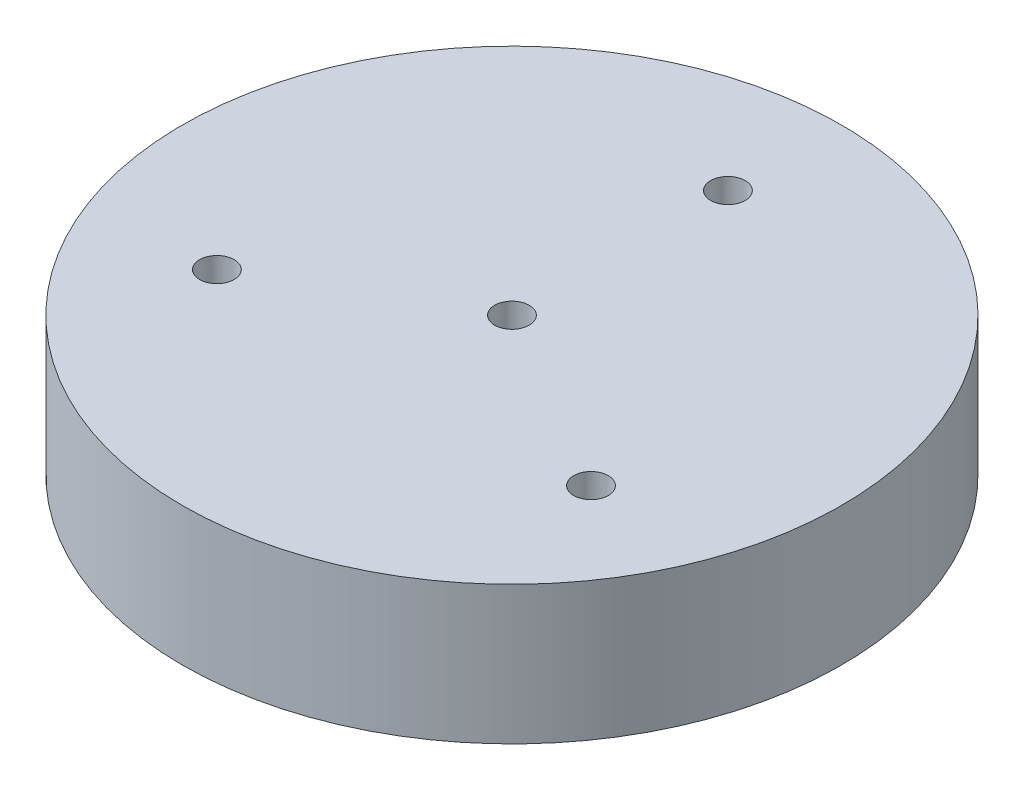
ISO-10303-21;
HEADER;
FILE_DESCRIPTION(('STEP AP214'),'2;1');
FILE_NAME('part.step','',(''),(''),'','','');
FILE_SCHEMA(('AUTOMOTIVE_DESIGN { 1 0 10303 214 1 1 1 1 }'));
ENDSEC;
DATA;
#1=APPLICATION_CONTEXT('core data for automotive mechanical design processes');
#2=APPLICATION_PROTOCOL_DEFINITION('international standard','automotive_design',2000,#1);
#3=PRODUCT_CONTEXT('',#1,'mechanical');
#4=PRODUCT('Part','Part','',(#3));
#5=PRODUCT_RELATED_PRODUCT_CATEGORY('part','',(#4));
#6=PRODUCT_DEFINITION_FORMATION('','',#4);
#7=PRODUCT_DEFINITION_CONTEXT('part definition',#1,'design');
#8=PRODUCT_DEFINITION('design','',#6,#7);
#9=PRODUCT_DEFINITION_SHAPE('','',#8);
#10=(LENGTH_UNIT() NAMED_UNIT(*) SI_UNIT(.MILLI.,.METRE.));
#11=(NAMED_UNIT(*) PLANE_ANGLE_UNIT() SI_UNIT($,.RADIAN.));
#12=(NAMED_UNIT(*) SI_UNIT($,.STERADIAN.) SOLID_ANGLE_UNIT());
#13=UNCERTAINTY_MEASURE_WITH_UNIT(LENGTH_MEASURE(1.E-05),#10,'distance_accuracy_value','');
#14=(GEOMETRIC_REPRESENTATION_CONTEXT(3) GLOBAL_UNCERTAINTY_ASSIGNED_CONTEXT((#13)) GLOBAL_UNIT_ASSIGNED_CONTEXT((#10,
#11,#12)) REPRESENTATION_CONTEXT('',''));
#15=CARTESIAN_POINT('',(0.,0.,0.));
#16=DIRECTION('',(0.,0.,1.));
#17=DIRECTION('',(1.,0.,0.));
#18=AXIS2_PLACEMENT_3D('',#15,#16,#17);
#19=CARTESIAN_POINT('',(0.,32.,0.));
#20=DIRECTION('',(0.,-1.,0.));
#21=DIRECTION('',(0.,0.,-1.));
#22=AXIS2_PLACEMENT_3D('',#19,#20,#21);
#23=CYLINDRICAL_SURFACE('',#22,76.29);
#24=CARTESIAN_POINT('',(0.,32.,0.));
#25=DIRECTION('',(0.,1.,0.));
#26=DIRECTION('',(0.,0.,1.));
#27=AXIS2_PLACEMENT_3D('',#24,#25,#26);
#28=CIRCLE('',#27,76.29);
#29=CARTESIAN_POINT('',(0.,32.,76.29));
#30=VERTEX_POINT('',#29);
#31=EDGE_CURVE('E10',#30,#30,#28,.T.);
#32=ORIENTED_EDGE('',*,*,#31,.F.);
#33=EDGE_LOOP('',(#32));
#34=FACE_BOUND('',#33,.T.);
#35=CARTESIAN_POINT('',(0.,0.,0.));
#36=DIRECTION('',(0.,1.,0.));
#37=DIRECTION('',(0.,0.,1.));
#38=AXIS2_PLACEMENT_3D('',#35,#36,#37);
#39=CIRCLE('',#38,76.29);
#40=CARTESIAN_POINT('',(0.,0.,76.29));
#41=VERTEX_POINT('',#40);
#42=EDGE_CURVE('E35',#41,#41,#39,.T.);
#43=ORIENTED_EDGE('',*,*,#42,.T.);
#44=EDGE_LOOP('',(#43));
#45=FACE_BOUND('',#44,.T.);
#46=ADVANCED_FACE('F32',(#34,#45),#23,.T.);
#47=CARTESIAN_POINT('',(0.,32.,0.));
#48=DIRECTION('',(0.,1.,0.));
#49=DIRECTION('',(0.,0.,1.));
#50=AXIS2_PLACEMENT_3D('',#47,#48,#49);
#51=PLANE('',#50);
#52=CARTESIAN_POINT('',(0.,32.,0.));
#53=DIRECTION('',(0.,1.,0.));
#54=DIRECTION('',(0.,0.,1.));
#55=AXIS2_PLACEMENT_3D('',#52,#53,#54);
#56=CIRCLE('',#55,4.);
#57=CARTESIAN_POINT('',(0.,32.,4.));
#58=VERTEX_POINT('',#57);
#59=EDGE_CURVE('E62',#58,#58,#56,.T.);
#60=ORIENTED_EDGE('',*,*,#59,.F.);
#61=EDGE_LOOP('',(#60));
#62=FACE_BOUND('',#61,.T.);
#63=CARTESIAN_POINT('',(-43.3012701892222,32.,24.9999999999996));
#64=DIRECTION('',(0.,1.,0.));
#65=DIRECTION('',(0.866025403784443,0.,-0.499999999999992));
#66=AXIS2_PLACEMENT_3D('',#63,#64,#65);
#67=CIRCLE('',#66,4.);
#68=CARTESIAN_POINT('',(-39.8371685740844,32.,22.9999999999996));
#69=VERTEX_POINT('',#68);
#70=EDGE_CURVE('E56',#69,#69,#67,.T.);
#71=ORIENTED_EDGE('',*,*,#70,.F.);
#72=EDGE_LOOP('',(#71));
#73=FACE_BOUND('',#72,.T.);
#74=CARTESIAN_POINT('',(43.3012701892218,32.,25.0000000000002));
#75=DIRECTION('',(0.,1.,0.));
#76=DIRECTION('',(-0.866025403784436,0.,-0.500000000000004));
#77=AXIS2_PLACEMENT_3D('',#74,#75,#76);
#78=CIRCLE('',#77,4.);
#79=CARTESIAN_POINT('',(39.8371685740841,32.,23.0000000000002));
#80=VERTEX_POINT('',#79);
#81=EDGE_CURVE('E50',#80,#80,#78,.T.);
#82=ORIENTED_EDGE('',*,*,#81,.F.);
#83=EDGE_LOOP('',(#82));
#84=FACE_BOUND('',#83,.T.);
#85=CARTESIAN_POINT('',(0.,32.,-50.));
#86=DIRECTION('',(0.,1.,0.));
#87=DIRECTION('',(0.,0.,1.));
#88=AXIS2_PLACEMENT_3D('',#85,#86,#87);
#89=CIRCLE('',#88,4.);
#90=CARTESIAN_POINT('',(0.,32.,-46.));
#91=VERTEX_POINT('',#90);
#92=EDGE_CURVE('E44',#91,#91,#89,.T.);
#93=ORIENTED_EDGE('',*,*,#92,.F.);
#94=EDGE_LOOP('',(#93));
#95=FACE_BOUND('',#94,.T.);
#96=ORIENTED_EDGE('',*,*,#31,.T.);
#97=EDGE_LOOP('',(#96));
#98=FACE_BOUND('',#97,.T.);
#99=ADVANCED_FACE('F78',(#62,#73,#84,#95,#98),#51,.T.);
#100=CARTESIAN_POINT('',(0.,0.,0.));
#101=DIRECTION('',(0.,1.,0.));
#102=DIRECTION('',(0.,0.,1.));
#103=AXIS2_PLACEMENT_3D('',#100,#101,#102);
#104=PLANE('',#103);
#105=CARTESIAN_POINT('',(0.,0.,0.));
#106=DIRECTION('',(0.,1.,0.));
#107=DIRECTION('',(0.,0.,1.));
#108=AXIS2_PLACEMENT_3D('',#105,#106,#107);
#109=CIRCLE('',#108,4.);
#110=CARTESIAN_POINT('',(0.,0.,4.));
#111=VERTEX_POINT('',#110);
#112=EDGE_CURVE('E59',#111,#111,#109,.T.);
#113=ORIENTED_EDGE('',*,*,#112,.T.);
#114=EDGE_LOOP('',(#113));
#115=FACE_BOUND('',#114,.T.);
#116=CARTESIAN_POINT('',(-43.3012701892222,0.,24.9999999999996));
#117=DIRECTION('',(0.,1.,0.));
#118=DIRECTION('',(0.866025403784443,0.,-0.499999999999992));
#119=AXIS2_PLACEMENT_3D('',#116,#117,#118);
#120=CIRCLE('',#119,4.);
#121=CARTESIAN_POINT('',(-39.8371685740844,0.,22.9999999999996));
#122=VERTEX_POINT('',#121);
#123=EDGE_CURVE('E53',#122,#122,#120,.T.);
#124=ORIENTED_EDGE('',*,*,#123,.T.);
#125=EDGE_LOOP('',(#124));
#126=FACE_BOUND('',#125,.T.);
#127=CARTESIAN_POINT('',(43.3012701892218,0.,25.0000000000002));
#128=DIRECTION('',(0.,1.,0.));
#129=DIRECTION('',(-0.866025403784436,0.,-0.500000000000004));
#130=AXIS2_PLACEMENT_3D('',#127,#128,#129);
#131=CIRCLE('',#130,4.);
#132=CARTESIAN_POINT('',(39.8371685740841,0.,23.0000000000002));
#133=VERTEX_POINT('',#132);
#134=EDGE_CURVE('E47',#133,#133,#131,.T.);
#135=ORIENTED_EDGE('',*,*,#134,.T.);
#136=EDGE_LOOP('',(#135));
#137=FACE_BOUND('',#136,.T.);
#138=CARTESIAN_POINT('',(0.,0.,-50.));
#139=DIRECTION('',(0.,1.,0.));
#140=DIRECTION('',(0.,0.,1.));
#141=AXIS2_PLACEMENT_3D('',#138,#139,#140);
#142=CIRCLE('',#141,4.);
#143=CARTESIAN_POINT('',(0.,0.,-46.));
#144=VERTEX_POINT('',#143);
#145=EDGE_CURVE('E42',#144,#144,#142,.T.);
#146=ORIENTED_EDGE('',*,*,#145,.T.);
#147=EDGE_LOOP('',(#146));
#148=FACE_BOUND('',#147,.T.);
#149=ORIENTED_EDGE('',*,*,#42,.F.);
#150=EDGE_LOOP('',(#149));
#151=FACE_BOUND('',#150,.T.);
#152=ADVANCED_FACE('F68',(#115,#126,#137,#148,#151),#104,.F.);
#153=CARTESIAN_POINT('',(0.,0.,-50.));
#154=DIRECTION('',(0.,1.,0.));
#155=DIRECTION('',(0.,0.,1.));
#156=AXIS2_PLACEMENT_3D('',#153,#154,#155);
#157=CYLINDRICAL_SURFACE('',#156,4.);
#158=ORIENTED_EDGE('',*,*,#145,.F.);
#159=EDGE_LOOP('',(#158));
#160=FACE_BOUND('',#159,.T.);
#161=ORIENTED_EDGE('',*,*,#92,.T.);
#162=EDGE_LOOP('',(#161));
#163=FACE_BOUND('',#162,.T.);
#164=ADVANCED_FACE('F88',(#160,#163),#157,.F.);
#165=CARTESIAN_POINT('',(43.3012701892218,0.,25.0000000000002));
#166=DIRECTION('',(0.,1.,0.));
#167=DIRECTION('',(0.,0.,1.));
#168=AXIS2_PLACEMENT_3D('',#165,#166,#167);
#169=CYLINDRICAL_SURFACE('',#168,4.);
#170=ORIENTED_EDGE('',*,*,#134,.F.);
#171=EDGE_LOOP('',(#170));
#172=FACE_BOUND('',#171,.T.);
#173=ORIENTED_EDGE('',*,*,#81,.T.);
#174=EDGE_LOOP('',(#173));
#175=FACE_BOUND('',#174,.T.);
#176=ADVANCED_FACE('F90',(#172,#175),#169,.F.);
#177=CARTESIAN_POINT('',(-43.3012701892222,0.,24.9999999999996));
#178=DIRECTION('',(0.,1.,0.));
#179=DIRECTION('',(0.,0.,1.));
#180=AXIS2_PLACEMENT_3D('',#177,#178,#179);
#181=CYLINDRICAL_SURFACE('',#180,4.);
#182=ORIENTED_EDGE('',*,*,#123,.F.);
#183=EDGE_LOOP('',(#182));
#184=FACE_BOUND('',#183,.T.);
#185=ORIENTED_EDGE('',*,*,#70,.T.);
#186=EDGE_LOOP('',(#185));
#187=FACE_BOUND('',#186,.T.);
#188=ADVANCED_FACE('F74',(#184,#187),#181,.F.);
#189=CARTESIAN_POINT('',(0.,0.,0.));
#190=DIRECTION('',(0.,1.,0.));
#191=DIRECTION('',(0.,0.,1.));
#192=AXIS2_PLACEMENT_3D('',#189,#190,#191);
#193=CYLINDRICAL_SURFACE('',#192,4.);
#194=ORIENTED_EDGE('',*,*,#112,.F.);
#195=EDGE_LOOP('',(#194));
#196=FACE_BOUND('',#195,.T.);
#197=ORIENTED_EDGE('',*,*,#59,.T.);
#198=EDGE_LOOP('',(#197));
#199=FACE_BOUND('',#198,.T.);
#200=ADVANCED_FACE('F71',(#196,#199),#193,.F.);
#201=CLOSED_SHELL('',(#46,#99,#152,#164,#176,#188,#200));
#202=MANIFOLD_SOLID_BREP('B2',#201);
#203=ADVANCED_BREP_SHAPE_REPRESENTATION('',(#18,#202),#14);
#204=SHAPE_DEFINITION_REPRESENTATION(#9,#203);
ENDSEC;
END-ISO-10303-21;
